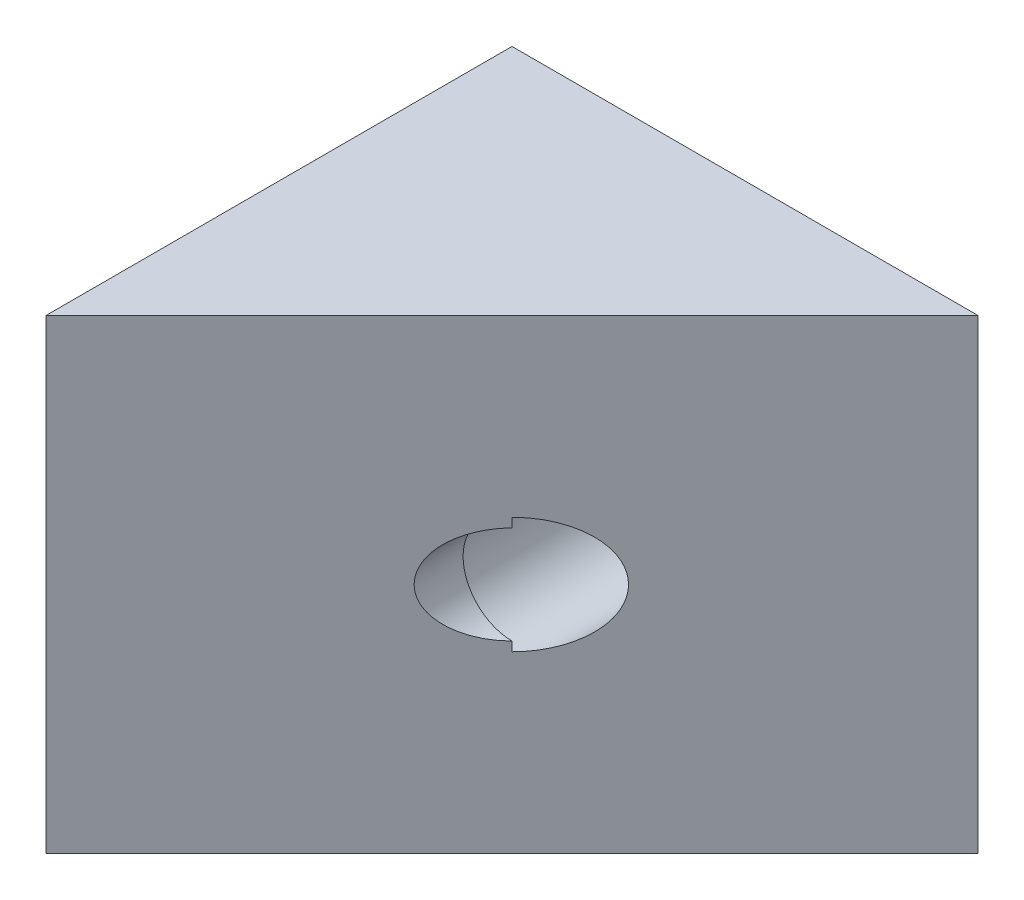
ISO-10303-21;
HEADER;
FILE_DESCRIPTION(('STEP AP214'),'2;1');
FILE_NAME('part.step','',(''),(''),'','','');
FILE_SCHEMA(('AUTOMOTIVE_DESIGN { 1 0 10303 214 1 1 1 1 }'));
ENDSEC;
DATA;
#1=APPLICATION_CONTEXT('core data for automotive mechanical design processes');
#2=APPLICATION_PROTOCOL_DEFINITION('international standard','automotive_design',2000,#1);
#3=PRODUCT_CONTEXT('',#1,'mechanical');
#4=PRODUCT('Part','Part','',(#3));
#5=PRODUCT_RELATED_PRODUCT_CATEGORY('part','',(#4));
#6=PRODUCT_DEFINITION_FORMATION('','',#4);
#7=PRODUCT_DEFINITION_CONTEXT('part definition',#1,'design');
#8=PRODUCT_DEFINITION('design','',#6,#7);
#9=PRODUCT_DEFINITION_SHAPE('','',#8);
#10=(LENGTH_UNIT() NAMED_UNIT(*) SI_UNIT(.MILLI.,.METRE.));
#11=(NAMED_UNIT(*) PLANE_ANGLE_UNIT() SI_UNIT($,.RADIAN.));
#12=(NAMED_UNIT(*) SI_UNIT($,.STERADIAN.) SOLID_ANGLE_UNIT());
#13=UNCERTAINTY_MEASURE_WITH_UNIT(LENGTH_MEASURE(1.E-05),#10,'distance_accuracy_value','');
#14=(GEOMETRIC_REPRESENTATION_CONTEXT(3) GLOBAL_UNCERTAINTY_ASSIGNED_CONTEXT((#13)) GLOBAL_UNIT_ASSIGNED_CONTEXT((#10,
#11,#12)) REPRESENTATION_CONTEXT('',''));
#15=CARTESIAN_POINT('',(0.,0.,0.));
#16=DIRECTION('',(0.,0.,1.));
#17=DIRECTION('',(1.,0.,0.));
#18=AXIS2_PLACEMENT_3D('',#15,#16,#17);
#19=CARTESIAN_POINT('',(0.,10.,19.9999999999998));
#20=DIRECTION('',(1.,0.,0.));
#21=DIRECTION('',(0.,0.,-1.));
#22=AXIS2_PLACEMENT_3D('',#19,#20,#21);
#23=PLANE('',#22);
#24=DIRECTION('',(0.,0.,1.));
#25=VECTOR('',#24,1.);
#26=CARTESIAN_POINT('',(0.,-10.,19.9999999999998));
#27=LINE('',#26,#25);
#28=CARTESIAN_POINT('',(0.,-10.,0.));
#29=VERTEX_POINT('',#28);
#30=CARTESIAN_POINT('',(0.,-10.,19.9999999999998));
#31=VERTEX_POINT('',#30);
#32=EDGE_CURVE('E115',#29,#31,#27,.T.);
#33=ORIENTED_EDGE('',*,*,#32,.T.);
#34=DIRECTION('',(0.,-1.,0.));
#35=VECTOR('',#34,1.);
#36=CARTESIAN_POINT('',(0.,10.,19.9999999999998));
#37=LINE('',#36,#35);
#38=CARTESIAN_POINT('',(0.,10.,19.9999999999998));
#39=VERTEX_POINT('',#38);
#40=EDGE_CURVE('E95',#39,#31,#37,.T.);
#41=ORIENTED_EDGE('',*,*,#40,.F.);
#42=DIRECTION('',(0.,0.,1.));
#43=VECTOR('',#42,1.);
#44=CARTESIAN_POINT('',(0.,10.,19.9999999999998));
#45=LINE('',#44,#43);
#46=CARTESIAN_POINT('',(0.,10.,0.));
#47=VERTEX_POINT('',#46);
#48=EDGE_CURVE('E112',#47,#39,#45,.T.);
#49=ORIENTED_EDGE('',*,*,#48,.F.);
#50=DIRECTION('',(0.,-1.,0.));
#51=VECTOR('',#50,1.);
#52=CARTESIAN_POINT('',(0.,10.,0.));
#53=LINE('',#52,#51);
#54=EDGE_CURVE('E109',#47,#29,#53,.T.);
#55=ORIENTED_EDGE('',*,*,#54,.T.);
#56=EDGE_LOOP('',(#33,#41,#49,#55));
#57=FACE_BOUND('',#56,.T.);
#58=ADVANCED_FACE('F35',(#57),#23,.F.);
#59=CARTESIAN_POINT('',(20.,10.,0.));
#60=DIRECTION('',(-0.707106781186544,0.,-0.707106781186551));
#61=DIRECTION('',(-0.707106781186551,0.,0.707106781186544));
#62=AXIS2_PLACEMENT_3D('',#59,#60,#61);
#63=PLANE('',#62);
#64=DIRECTION('',(0.,1.,0.));
#65=VECTOR('',#64,1.);
#66=CARTESIAN_POINT('',(9.9999999999999,10.,10.));
#67=LINE('',#66,#65);
#68=CARTESIAN_POINT('',(9.9999999999999,-2.5,10.));
#69=VERTEX_POINT('',#68);
#70=CARTESIAN_POINT('',(9.9999999999999,-2.1,10.));
#71=VERTEX_POINT('',#70);
#72=EDGE_CURVE('E42',#69,#71,#67,.T.);
#73=ORIENTED_EDGE('',*,*,#72,.T.);
#74=CARTESIAN_POINT('',(10.,0.,9.9999999999999));
#75=DIRECTION('',(-0.707106781186544,0.,-0.707106781186551));
#76=DIRECTION('',(0.707106781186551,0.,-0.707106781186544));
#77=AXIS2_PLACEMENT_3D('',#74,#75,#76);
#78=ELLIPSE('',#77,2.96984848098348,2.1);
#79=CARTESIAN_POINT('',(9.9999999999999,2.1,10.));
#80=VERTEX_POINT('',#79);
#81=EDGE_CURVE('E11',#71,#80,#78,.T.);
#82=ORIENTED_EDGE('',*,*,#81,.T.);
#83=CARTESIAN_POINT('',(9.9999999999999,2.5,10.));
#84=VERTEX_POINT('',#83);
#85=EDGE_CURVE('E94',#80,#84,#67,.T.);
#86=ORIENTED_EDGE('',*,*,#85,.T.);
#87=CARTESIAN_POINT('',(10.,0.,9.9999999999999));
#88=DIRECTION('',(-0.707106781186544,0.,-0.707106781186551));
#89=DIRECTION('',(0.707106781186551,0.,-0.707106781186544));
#90=AXIS2_PLACEMENT_3D('',#87,#88,#89);
#91=ELLIPSE('',#90,3.53553390593272,2.5);
#92=EDGE_CURVE('E89',#84,#69,#91,.T.);
#93=ORIENTED_EDGE('',*,*,#92,.T.);
#94=EDGE_LOOP('',(#73,#82,#86,#93));
#95=FACE_BOUND('',#94,.T.);
#96=DIRECTION('',(0.707106781186551,0.,-0.707106781186544));
#97=VECTOR('',#96,1.);
#98=CARTESIAN_POINT('',(20.,-10.,0.));
#99=LINE('',#98,#97);
#100=CARTESIAN_POINT('',(20.,-10.,0.));
#101=VERTEX_POINT('',#100);
#102=EDGE_CURVE('E113',#31,#101,#99,.T.);
#103=ORIENTED_EDGE('',*,*,#102,.T.);
#104=DIRECTION('',(0.,-1.,0.));
#105=VECTOR('',#104,1.);
#106=CARTESIAN_POINT('',(20.,10.,0.));
#107=LINE('',#106,#105);
#108=CARTESIAN_POINT('',(20.,10.,0.));
#109=VERTEX_POINT('',#108);
#110=EDGE_CURVE('E107',#109,#101,#107,.T.);
#111=ORIENTED_EDGE('',*,*,#110,.F.);
#112=DIRECTION('',(0.707106781186551,0.,-0.707106781186544));
#113=VECTOR('',#112,1.);
#114=CARTESIAN_POINT('',(20.,10.,0.));
#115=LINE('',#114,#113);
#116=EDGE_CURVE('E80',#39,#109,#115,.T.);
#117=ORIENTED_EDGE('',*,*,#116,.F.);
#118=ORIENTED_EDGE('',*,*,#40,.T.);
#119=EDGE_LOOP('',(#103,#111,#117,#118));
#120=FACE_BOUND('',#119,.T.);
#121=ADVANCED_FACE('F104',(#95,#120),#63,.F.);
#122=CARTESIAN_POINT('',(0.,10.,0.));
#123=DIRECTION('',(0.,0.,1.));
#124=DIRECTION('',(1.,0.,0.));
#125=AXIS2_PLACEMENT_3D('',#122,#123,#124);
#126=PLANE('',#125);
#127=CARTESIAN_POINT('',(10.,0.,0.));
#128=DIRECTION('',(0.,0.,-1.));
#129=DIRECTION('',(-1.,0.,0.));
#130=AXIS2_PLACEMENT_3D('',#127,#128,#129);
#131=CIRCLE('',#130,2.5);
#132=CARTESIAN_POINT('',(7.5,0.,0.));
#133=VERTEX_POINT('',#132);
#134=EDGE_CURVE('E102',#133,#133,#131,.T.);
#135=ORIENTED_EDGE('',*,*,#134,.F.);
#136=EDGE_LOOP('',(#135));
#137=FACE_BOUND('',#136,.T.);
#138=DIRECTION('',(-1.,0.,0.));
#139=VECTOR('',#138,1.);
#140=CARTESIAN_POINT('',(0.,-10.,0.));
#141=LINE('',#140,#139);
#142=EDGE_CURVE('E74',#101,#29,#141,.T.);
#143=ORIENTED_EDGE('',*,*,#142,.T.);
#144=ORIENTED_EDGE('',*,*,#54,.F.);
#145=DIRECTION('',(-1.,0.,0.));
#146=VECTOR('',#145,1.);
#147=CARTESIAN_POINT('',(0.,10.,0.));
#148=LINE('',#147,#146);
#149=EDGE_CURVE('E57',#109,#47,#148,.T.);
#150=ORIENTED_EDGE('',*,*,#149,.F.);
#151=ORIENTED_EDGE('',*,*,#110,.T.);
#152=EDGE_LOOP('',(#143,#144,#150,#151));
#153=FACE_BOUND('',#152,.T.);
#154=ADVANCED_FACE('F126',(#137,#153),#126,.F.);
#155=CARTESIAN_POINT('',(0.,10.,0.));
#156=DIRECTION('',(0.,-1.,0.));
#157=DIRECTION('',(0.,0.,-1.));
#158=AXIS2_PLACEMENT_3D('',#155,#156,#157);
#159=PLANE('',#158);
#160=ORIENTED_EDGE('',*,*,#48,.T.);
#161=ORIENTED_EDGE('',*,*,#116,.T.);
#162=ORIENTED_EDGE('',*,*,#149,.T.);
#163=EDGE_LOOP('',(#160,#161,#162));
#164=FACE_BOUND('',#163,.T.);
#165=ADVANCED_FACE('F128',(#164),#159,.F.);
#166=CARTESIAN_POINT('',(0.,-10.,0.));
#167=DIRECTION('',(0.,-1.,0.));
#168=DIRECTION('',(0.,0.,-1.));
#169=AXIS2_PLACEMENT_3D('',#166,#167,#168);
#170=PLANE('',#169);
#171=ORIENTED_EDGE('',*,*,#32,.F.);
#172=ORIENTED_EDGE('',*,*,#142,.F.);
#173=ORIENTED_EDGE('',*,*,#102,.F.);
#174=EDGE_LOOP('',(#171,#172,#173));
#175=FACE_BOUND('',#174,.T.);
#176=ADVANCED_FACE('F134',(#175),#170,.T.);
#177=CARTESIAN_POINT('',(12.1,0.,10.));
#178=DIRECTION('',(0.,0.,1.));
#179=DIRECTION('',(1.,0.,0.));
#180=AXIS2_PLACEMENT_3D('',#177,#178,#179);
#181=PLANE('',#180);
#182=CARTESIAN_POINT('',(10.,0.,10.));
#183=DIRECTION('',(0.,0.,-1.));
#184=DIRECTION('',(-1.,0.,0.));
#185=AXIS2_PLACEMENT_3D('',#182,#183,#184);
#186=CIRCLE('',#185,2.5);
#187=EDGE_CURVE('E48',#69,#84,#186,.T.);
#188=ORIENTED_EDGE('',*,*,#187,.T.);
#189=ORIENTED_EDGE('',*,*,#85,.F.);
#190=CARTESIAN_POINT('',(10.,0.,10.));
#191=DIRECTION('',(0.,0.,-1.));
#192=DIRECTION('',(-1.,0.,0.));
#193=AXIS2_PLACEMENT_3D('',#190,#191,#192);
#194=CIRCLE('',#193,2.1);
#195=EDGE_CURVE('E101',#71,#80,#194,.T.);
#196=ORIENTED_EDGE('',*,*,#195,.F.);
#197=ORIENTED_EDGE('',*,*,#72,.F.);
#198=EDGE_LOOP('',(#188,#189,#196,#197));
#199=FACE_BOUND('',#198,.T.);
#200=ADVANCED_FACE('F98',(#199),#181,.F.);
#201=CARTESIAN_POINT('',(10.,0.,0.));
#202=DIRECTION('',(0.,0.,-1.));
#203=DIRECTION('',(-1.,0.,0.));
#204=AXIS2_PLACEMENT_3D('',#201,#202,#203);
#205=CYLINDRICAL_SURFACE('',#204,2.1);
#206=ORIENTED_EDGE('',*,*,#195,.T.);
#207=ORIENTED_EDGE('',*,*,#81,.F.);
#208=EDGE_LOOP('',(#206,#207));
#209=FACE_BOUND('',#208,.T.);
#210=ADVANCED_FACE('F149',(#209),#205,.F.);
#211=CARTESIAN_POINT('',(10.,0.,0.));
#212=DIRECTION('',(0.,0.,-1.));
#213=DIRECTION('',(-1.,0.,0.));
#214=AXIS2_PLACEMENT_3D('',#211,#212,#213);
#215=CYLINDRICAL_SURFACE('',#214,2.5);
#216=ORIENTED_EDGE('',*,*,#134,.T.);
#217=EDGE_LOOP('',(#216));
#218=FACE_BOUND('',#217,.T.);
#219=ORIENTED_EDGE('',*,*,#187,.F.);
#220=ORIENTED_EDGE('',*,*,#92,.F.);
#221=EDGE_LOOP('',(#219,#220));
#222=FACE_BOUND('',#221,.T.);
#223=ADVANCED_FACE('F90',(#218,#222),#215,.F.);
#224=CLOSED_SHELL('',(#58,#121,#154,#165,#176,#200,#210,#223));
#225=MANIFOLD_SOLID_BREP('B2',#224);
#226=ADVANCED_BREP_SHAPE_REPRESENTATION('',(#18,#225),#14);
#227=SHAPE_DEFINITION_REPRESENTATION(#9,#226);
ENDSEC;
END-ISO-10303-21;
